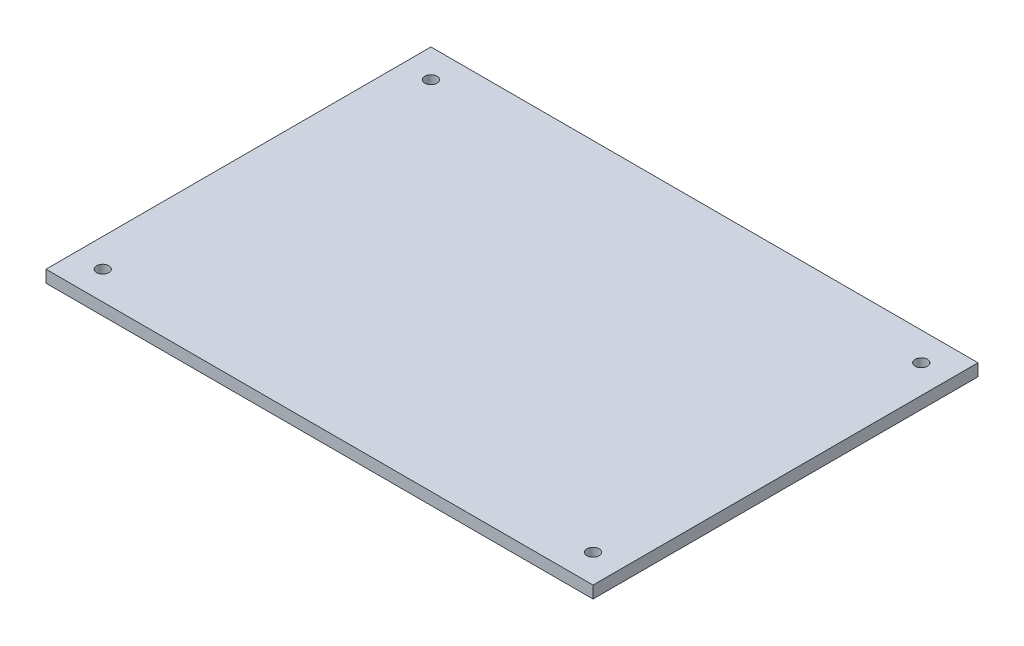
ISO-10303-21;
HEADER;
FILE_DESCRIPTION(('STEP AP214'),'2;1');
FILE_NAME('part.step','',(''),(''),'','','');
FILE_SCHEMA(('AUTOMOTIVE_DESIGN { 1 0 10303 214 1 1 1 1 }'));
ENDSEC;
DATA;
#1=APPLICATION_CONTEXT('core data for automotive mechanical design processes');
#2=APPLICATION_PROTOCOL_DEFINITION('international standard','automotive_design',2000,#1);
#3=PRODUCT_CONTEXT('',#1,'mechanical');
#4=PRODUCT('Part','Part','',(#3));
#5=PRODUCT_RELATED_PRODUCT_CATEGORY('part','',(#4));
#6=PRODUCT_DEFINITION_FORMATION('','',#4);
#7=PRODUCT_DEFINITION_CONTEXT('part definition',#1,'design');
#8=PRODUCT_DEFINITION('design','',#6,#7);
#9=PRODUCT_DEFINITION_SHAPE('','',#8);
#10=(LENGTH_UNIT() NAMED_UNIT(*) SI_UNIT(.MILLI.,.METRE.));
#11=(NAMED_UNIT(*) PLANE_ANGLE_UNIT() SI_UNIT($,.RADIAN.));
#12=(NAMED_UNIT(*) SI_UNIT($,.STERADIAN.) SOLID_ANGLE_UNIT());
#13=UNCERTAINTY_MEASURE_WITH_UNIT(LENGTH_MEASURE(1.E-05),#10,'distance_accuracy_value','');
#14=(GEOMETRIC_REPRESENTATION_CONTEXT(3) GLOBAL_UNCERTAINTY_ASSIGNED_CONTEXT((#13)) GLOBAL_UNIT_ASSIGNED_CONTEXT((#10,
#11,#12)) REPRESENTATION_CONTEXT('',''));
#15=CARTESIAN_POINT('',(0.,0.,0.));
#16=DIRECTION('',(0.,0.,1.));
#17=DIRECTION('',(1.,0.,0.));
#18=AXIS2_PLACEMENT_3D('',#15,#16,#17);
#19=CARTESIAN_POINT('',(-67.5,3.,47.5));
#20=DIRECTION('',(1.,0.,0.));
#21=DIRECTION('',(0.,0.,-1.));
#22=AXIS2_PLACEMENT_3D('',#19,#20,#21);
#23=PLANE('',#22);
#24=DIRECTION('',(0.,0.,1.));
#25=VECTOR('',#24,1.);
#26=CARTESIAN_POINT('',(-67.5,0.,47.5));
#27=LINE('',#26,#25);
#28=CARTESIAN_POINT('',(-67.5,0.,-47.5));
#29=VERTEX_POINT('',#28);
#30=CARTESIAN_POINT('',(-67.5,0.,47.5));
#31=VERTEX_POINT('',#30);
#32=EDGE_CURVE('E95',#29,#31,#27,.T.);
#33=ORIENTED_EDGE('',*,*,#32,.T.);
#34=DIRECTION('',(0.,-1.,0.));
#35=VECTOR('',#34,1.);
#36=CARTESIAN_POINT('',(-67.5,3.,47.5));
#37=LINE('',#36,#35);
#38=CARTESIAN_POINT('',(-67.5,3.,47.5));
#39=VERTEX_POINT('',#38);
#40=EDGE_CURVE('E11',#39,#31,#37,.T.);
#41=ORIENTED_EDGE('',*,*,#40,.F.);
#42=DIRECTION('',(0.,0.,1.));
#43=VECTOR('',#42,1.);
#44=CARTESIAN_POINT('',(-67.5,3.,47.5));
#45=LINE('',#44,#43);
#46=CARTESIAN_POINT('',(-67.5,3.,-47.5));
#47=VERTEX_POINT('',#46);
#48=EDGE_CURVE('E83',#47,#39,#45,.T.);
#49=ORIENTED_EDGE('',*,*,#48,.F.);
#50=DIRECTION('',(0.,-1.,0.));
#51=VECTOR('',#50,1.);
#52=CARTESIAN_POINT('',(-67.5,3.,-47.5));
#53=LINE('',#52,#51);
#54=EDGE_CURVE('E91',#47,#29,#53,.T.);
#55=ORIENTED_EDGE('',*,*,#54,.T.);
#56=EDGE_LOOP('',(#33,#41,#49,#55));
#57=FACE_BOUND('',#56,.T.);
#58=ADVANCED_FACE('F32',(#57),#23,.F.);
#59=CARTESIAN_POINT('',(67.5,3.,47.5));
#60=DIRECTION('',(0.,0.,-1.));
#61=DIRECTION('',(-1.,0.,0.));
#62=AXIS2_PLACEMENT_3D('',#59,#60,#61);
#63=PLANE('',#62);
#64=DIRECTION('',(1.,0.,0.));
#65=VECTOR('',#64,1.);
#66=CARTESIAN_POINT('',(67.5,0.,47.5));
#67=LINE('',#66,#65);
#68=CARTESIAN_POINT('',(67.5,0.,47.5));
#69=VERTEX_POINT('',#68);
#70=EDGE_CURVE('E87',#31,#69,#67,.T.);
#71=ORIENTED_EDGE('',*,*,#70,.T.);
#72=DIRECTION('',(0.,-1.,0.));
#73=VECTOR('',#72,1.);
#74=CARTESIAN_POINT('',(67.5,3.,47.5));
#75=LINE('',#74,#73);
#76=CARTESIAN_POINT('',(67.5,3.,47.5));
#77=VERTEX_POINT('',#76);
#78=EDGE_CURVE('E40',#77,#69,#75,.T.);
#79=ORIENTED_EDGE('',*,*,#78,.F.);
#80=DIRECTION('',(1.,0.,0.));
#81=VECTOR('',#80,1.);
#82=CARTESIAN_POINT('',(67.5,3.,47.5));
#83=LINE('',#82,#81);
#84=EDGE_CURVE('E78',#39,#77,#83,.T.);
#85=ORIENTED_EDGE('',*,*,#84,.F.);
#86=ORIENTED_EDGE('',*,*,#40,.T.);
#87=EDGE_LOOP('',(#71,#79,#85,#86));
#88=FACE_BOUND('',#87,.T.);
#89=ADVANCED_FACE('F86',(#88),#63,.F.);
#90=CARTESIAN_POINT('',(67.5,3.,47.5));
#91=DIRECTION('',(-1.,0.,0.));
#92=DIRECTION('',(0.,0.,1.));
#93=AXIS2_PLACEMENT_3D('',#90,#91,#92);
#94=PLANE('',#93);
#95=DIRECTION('',(0.,0.,-1.));
#96=VECTOR('',#95,1.);
#97=CARTESIAN_POINT('',(67.5,0.,47.5));
#98=LINE('',#97,#96);
#99=CARTESIAN_POINT('',(67.5,0.,-47.5));
#100=VERTEX_POINT('',#99);
#101=EDGE_CURVE('E65',#69,#100,#98,.T.);
#102=ORIENTED_EDGE('',*,*,#101,.T.);
#103=DIRECTION('',(0.,-1.,0.));
#104=VECTOR('',#103,1.);
#105=CARTESIAN_POINT('',(67.5,3.,-47.5));
#106=LINE('',#105,#104);
#107=CARTESIAN_POINT('',(67.5,3.,-47.5));
#108=VERTEX_POINT('',#107);
#109=EDGE_CURVE('E88',#108,#100,#106,.T.);
#110=ORIENTED_EDGE('',*,*,#109,.F.);
#111=DIRECTION('',(0.,0.,-1.));
#112=VECTOR('',#111,1.);
#113=CARTESIAN_POINT('',(67.5,3.,47.5));
#114=LINE('',#113,#112);
#115=EDGE_CURVE('E81',#77,#108,#114,.T.);
#116=ORIENTED_EDGE('',*,*,#115,.F.);
#117=ORIENTED_EDGE('',*,*,#78,.T.);
#118=EDGE_LOOP('',(#102,#110,#116,#117));
#119=FACE_BOUND('',#118,.T.);
#120=ADVANCED_FACE('F89',(#119),#94,.F.);
#121=CARTESIAN_POINT('',(67.5,3.,-47.5));
#122=DIRECTION('',(0.,0.,1.));
#123=DIRECTION('',(1.,0.,0.));
#124=AXIS2_PLACEMENT_3D('',#121,#122,#123);
#125=PLANE('',#124);
#126=DIRECTION('',(-1.,0.,0.));
#127=VECTOR('',#126,1.);
#128=CARTESIAN_POINT('',(67.5,0.,-47.5));
#129=LINE('',#128,#127);
#130=EDGE_CURVE('E71',#100,#29,#129,.T.);
#131=ORIENTED_EDGE('',*,*,#130,.T.);
#132=ORIENTED_EDGE('',*,*,#54,.F.);
#133=DIRECTION('',(-1.,0.,0.));
#134=VECTOR('',#133,1.);
#135=CARTESIAN_POINT('',(67.5,3.,-47.5));
#136=LINE('',#135,#134);
#137=EDGE_CURVE('E48',#108,#47,#136,.T.);
#138=ORIENTED_EDGE('',*,*,#137,.F.);
#139=ORIENTED_EDGE('',*,*,#109,.T.);
#140=EDGE_LOOP('',(#131,#132,#138,#139));
#141=FACE_BOUND('',#140,.T.);
#142=ADVANCED_FACE('F103',(#141),#125,.F.);
#143=CARTESIAN_POINT('',(0.,3.,0.));
#144=DIRECTION('',(0.,1.,0.));
#145=DIRECTION('',(0.,0.,1.));
#146=AXIS2_PLACEMENT_3D('',#143,#144,#145);
#147=PLANE('',#146);
#148=CARTESIAN_POINT('',(-60.5,3.,-40.5));
#149=DIRECTION('',(0.,1.,0.));
#150=DIRECTION('',(0.,0.,1.));
#151=AXIS2_PLACEMENT_3D('',#148,#149,#150);
#152=CIRCLE('',#151,1.500000048);
#153=CARTESIAN_POINT('',(-60.5,3.,-38.999999952));
#154=VERTEX_POINT('',#153);
#155=EDGE_CURVE('E129',#154,#154,#152,.T.);
#156=ORIENTED_EDGE('',*,*,#155,.F.);
#157=EDGE_LOOP('',(#156));
#158=FACE_BOUND('',#157,.T.);
#159=CARTESIAN_POINT('',(-60.5,3.,40.5));
#160=DIRECTION('',(0.,1.,0.));
#161=DIRECTION('',(0.,0.,1.));
#162=AXIS2_PLACEMENT_3D('',#159,#160,#161);
#163=CIRCLE('',#162,1.500000048);
#164=CARTESIAN_POINT('',(-60.5,3.,42.000000048));
#165=VERTEX_POINT('',#164);
#166=EDGE_CURVE('E123',#165,#165,#163,.T.);
#167=ORIENTED_EDGE('',*,*,#166,.F.);
#168=EDGE_LOOP('',(#167));
#169=FACE_BOUND('',#168,.T.);
#170=CARTESIAN_POINT('',(60.5,3.,-40.5));
#171=DIRECTION('',(0.,1.,0.));
#172=DIRECTION('',(0.,0.,1.));
#173=AXIS2_PLACEMENT_3D('',#170,#171,#172);
#174=CIRCLE('',#173,1.500000048);
#175=CARTESIAN_POINT('',(60.5,3.,-38.999999952));
#176=VERTEX_POINT('',#175);
#177=EDGE_CURVE('E117',#176,#176,#174,.T.);
#178=ORIENTED_EDGE('',*,*,#177,.F.);
#179=EDGE_LOOP('',(#178));
#180=FACE_BOUND('',#179,.T.);
#181=CARTESIAN_POINT('',(60.5,3.,40.5));
#182=DIRECTION('',(0.,1.,0.));
#183=DIRECTION('',(0.,0.,1.));
#184=AXIS2_PLACEMENT_3D('',#181,#182,#183);
#185=CIRCLE('',#184,1.500000048);
#186=CARTESIAN_POINT('',(60.5,3.,42.000000048));
#187=VERTEX_POINT('',#186);
#188=EDGE_CURVE('E111',#187,#187,#185,.T.);
#189=ORIENTED_EDGE('',*,*,#188,.F.);
#190=EDGE_LOOP('',(#189));
#191=FACE_BOUND('',#190,.T.);
#192=ORIENTED_EDGE('',*,*,#48,.T.);
#193=ORIENTED_EDGE('',*,*,#84,.T.);
#194=ORIENTED_EDGE('',*,*,#115,.T.);
#195=ORIENTED_EDGE('',*,*,#137,.T.);
#196=EDGE_LOOP('',(#192,#193,#194,#195));
#197=FACE_BOUND('',#196,.T.);
#198=ADVANCED_FACE('F79',(#158,#169,#180,#191,#197),#147,.T.);
#199=CARTESIAN_POINT('',(0.,0.,0.));
#200=DIRECTION('',(0.,1.,0.));
#201=DIRECTION('',(0.,0.,1.));
#202=AXIS2_PLACEMENT_3D('',#199,#200,#201);
#203=PLANE('',#202);
#204=CARTESIAN_POINT('',(-60.5,0.,-40.5));
#205=DIRECTION('',(0.,1.,0.));
#206=DIRECTION('',(0.,0.,1.));
#207=AXIS2_PLACEMENT_3D('',#204,#205,#206);
#208=CIRCLE('',#207,1.500000048);
#209=CARTESIAN_POINT('',(-60.5,0.,-38.999999952));
#210=VERTEX_POINT('',#209);
#211=EDGE_CURVE('E126',#210,#210,#208,.T.);
#212=ORIENTED_EDGE('',*,*,#211,.T.);
#213=EDGE_LOOP('',(#212));
#214=FACE_BOUND('',#213,.T.);
#215=CARTESIAN_POINT('',(-60.5,0.,40.5));
#216=DIRECTION('',(0.,1.,0.));
#217=DIRECTION('',(0.,0.,1.));
#218=AXIS2_PLACEMENT_3D('',#215,#216,#217);
#219=CIRCLE('',#218,1.500000048);
#220=CARTESIAN_POINT('',(-60.5,0.,42.000000048));
#221=VERTEX_POINT('',#220);
#222=EDGE_CURVE('E120',#221,#221,#219,.T.);
#223=ORIENTED_EDGE('',*,*,#222,.T.);
#224=EDGE_LOOP('',(#223));
#225=FACE_BOUND('',#224,.T.);
#226=CARTESIAN_POINT('',(60.5,0.,-40.5));
#227=DIRECTION('',(0.,1.,0.));
#228=DIRECTION('',(0.,0.,1.));
#229=AXIS2_PLACEMENT_3D('',#226,#227,#228);
#230=CIRCLE('',#229,1.500000048);
#231=CARTESIAN_POINT('',(60.5,0.,-38.999999952));
#232=VERTEX_POINT('',#231);
#233=EDGE_CURVE('E114',#232,#232,#230,.T.);
#234=ORIENTED_EDGE('',*,*,#233,.T.);
#235=EDGE_LOOP('',(#234));
#236=FACE_BOUND('',#235,.T.);
#237=CARTESIAN_POINT('',(60.5,0.,40.5));
#238=DIRECTION('',(0.,1.,0.));
#239=DIRECTION('',(0.,0.,1.));
#240=AXIS2_PLACEMENT_3D('',#237,#238,#239);
#241=CIRCLE('',#240,1.500000048);
#242=CARTESIAN_POINT('',(60.5,0.,42.000000048));
#243=VERTEX_POINT('',#242);
#244=EDGE_CURVE('E98',#243,#243,#241,.T.);
#245=ORIENTED_EDGE('',*,*,#244,.T.);
#246=EDGE_LOOP('',(#245));
#247=FACE_BOUND('',#246,.T.);
#248=ORIENTED_EDGE('',*,*,#32,.F.);
#249=ORIENTED_EDGE('',*,*,#130,.F.);
#250=ORIENTED_EDGE('',*,*,#101,.F.);
#251=ORIENTED_EDGE('',*,*,#70,.F.);
#252=EDGE_LOOP('',(#248,#249,#250,#251));
#253=FACE_BOUND('',#252,.T.);
#254=ADVANCED_FACE('F106',(#214,#225,#236,#247,#253),#203,.F.);
#255=CARTESIAN_POINT('',(60.5,3.,40.5));
#256=DIRECTION('',(0.,1.,0.));
#257=DIRECTION('',(0.,0.,1.));
#258=AXIS2_PLACEMENT_3D('',#255,#256,#257);
#259=CYLINDRICAL_SURFACE('',#258,1.500000048);
#260=ORIENTED_EDGE('',*,*,#244,.F.);
#261=EDGE_LOOP('',(#260));
#262=FACE_BOUND('',#261,.T.);
#263=ORIENTED_EDGE('',*,*,#188,.T.);
#264=EDGE_LOOP('',(#263));
#265=FACE_BOUND('',#264,.T.);
#266=ADVANCED_FACE('F144',(#262,#265),#259,.F.);
#267=CARTESIAN_POINT('',(60.5,3.,-40.5));
#268=DIRECTION('',(0.,1.,0.));
#269=DIRECTION('',(0.,0.,1.));
#270=AXIS2_PLACEMENT_3D('',#267,#268,#269);
#271=CYLINDRICAL_SURFACE('',#270,1.500000048);
#272=ORIENTED_EDGE('',*,*,#233,.F.);
#273=EDGE_LOOP('',(#272));
#274=FACE_BOUND('',#273,.T.);
#275=ORIENTED_EDGE('',*,*,#177,.T.);
#276=EDGE_LOOP('',(#275));
#277=FACE_BOUND('',#276,.T.);
#278=ADVANCED_FACE('F146',(#274,#277),#271,.F.);
#279=CARTESIAN_POINT('',(-60.5,3.,40.5));
#280=DIRECTION('',(0.,1.,0.));
#281=DIRECTION('',(0.,0.,1.));
#282=AXIS2_PLACEMENT_3D('',#279,#280,#281);
#283=CYLINDRICAL_SURFACE('',#282,1.500000048);
#284=ORIENTED_EDGE('',*,*,#222,.F.);
#285=EDGE_LOOP('',(#284));
#286=FACE_BOUND('',#285,.T.);
#287=ORIENTED_EDGE('',*,*,#166,.T.);
#288=EDGE_LOOP('',(#287));
#289=FACE_BOUND('',#288,.T.);
#290=ADVANCED_FACE('F153',(#286,#289),#283,.F.);
#291=CARTESIAN_POINT('',(-60.5,3.,-40.5));
#292=DIRECTION('',(0.,1.,0.));
#293=DIRECTION('',(0.,0.,1.));
#294=AXIS2_PLACEMENT_3D('',#291,#292,#293);
#295=CYLINDRICAL_SURFACE('',#294,1.500000048);
#296=ORIENTED_EDGE('',*,*,#211,.F.);
#297=EDGE_LOOP('',(#296));
#298=FACE_BOUND('',#297,.T.);
#299=ORIENTED_EDGE('',*,*,#155,.T.);
#300=EDGE_LOOP('',(#299));
#301=FACE_BOUND('',#300,.T.);
#302=ADVANCED_FACE('F133',(#298,#301),#295,.F.);
#303=CLOSED_SHELL('',(#58,#89,#120,#142,#198,#254,#266,#278,#290,#302));
#304=MANIFOLD_SOLID_BREP('B2',#303);
#305=ADVANCED_BREP_SHAPE_REPRESENTATION('',(#18,#304),#14);
#306=SHAPE_DEFINITION_REPRESENTATION(#9,#305);
ENDSEC;
END-ISO-10303-21;
